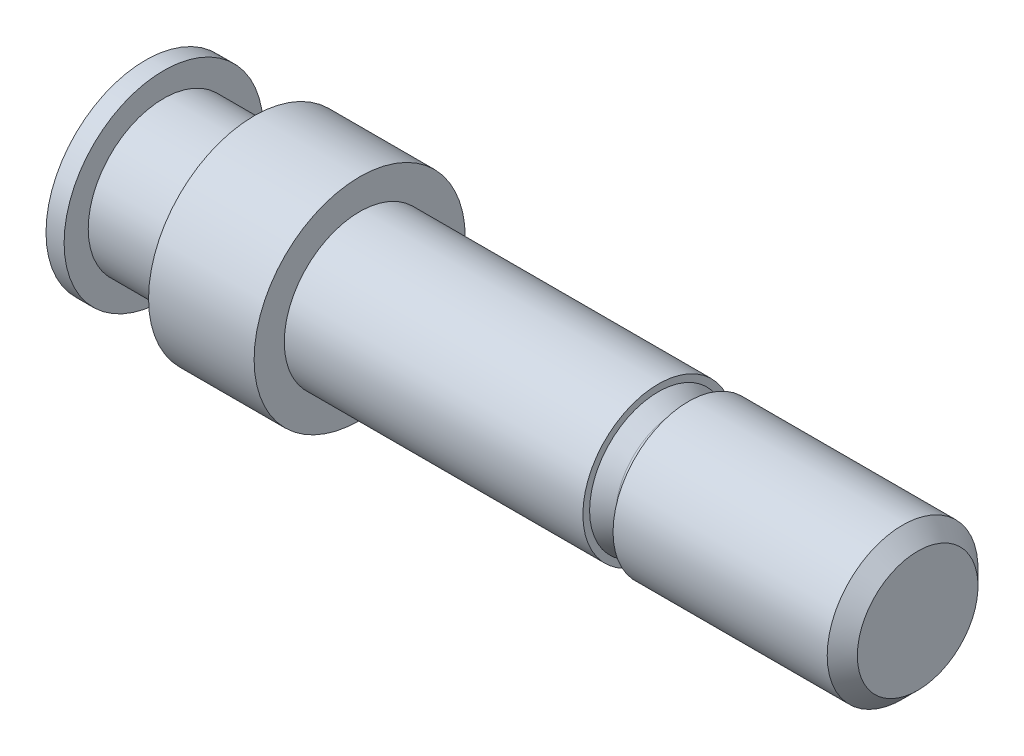
ISO-10303-21;
HEADER;
FILE_DESCRIPTION(('STEP AP214'),'2;1');
FILE_NAME('part.step','',(''),(''),'','','');
FILE_SCHEMA(('AUTOMOTIVE_DESIGN { 1 0 10303 214 1 1 1 1 }'));
ENDSEC;
DATA;
#1=APPLICATION_CONTEXT('core data for automotive mechanical design processes');
#2=APPLICATION_PROTOCOL_DEFINITION('international standard','automotive_design',2000,#1);
#3=PRODUCT_CONTEXT('',#1,'mechanical');
#4=PRODUCT('Part','Part','',(#3));
#5=PRODUCT_RELATED_PRODUCT_CATEGORY('part','',(#4));
#6=PRODUCT_DEFINITION_FORMATION('','',#4);
#7=PRODUCT_DEFINITION_CONTEXT('part definition',#1,'design');
#8=PRODUCT_DEFINITION('design','',#6,#7);
#9=PRODUCT_DEFINITION_SHAPE('','',#8);
#10=(LENGTH_UNIT() NAMED_UNIT(*) SI_UNIT(.MILLI.,.METRE.));
#11=(NAMED_UNIT(*) PLANE_ANGLE_UNIT() SI_UNIT($,.RADIAN.));
#12=(NAMED_UNIT(*) SI_UNIT($,.STERADIAN.) SOLID_ANGLE_UNIT());
#13=UNCERTAINTY_MEASURE_WITH_UNIT(LENGTH_MEASURE(1.E-05),#10,'distance_accuracy_value','');
#14=(GEOMETRIC_REPRESENTATION_CONTEXT(3) GLOBAL_UNCERTAINTY_ASSIGNED_CONTEXT((#13)) GLOBAL_UNIT_ASSIGNED_CONTEXT((#10,
#11,#12)) REPRESENTATION_CONTEXT('',''));
#15=CARTESIAN_POINT('',(0.,0.,0.));
#16=DIRECTION('',(0.,0.,1.));
#17=DIRECTION('',(1.,0.,0.));
#18=AXIS2_PLACEMENT_3D('',#15,#16,#17);
#19=CARTESIAN_POINT('',(0.,0.,0.));
#20=DIRECTION('',(-1.,0.,0.));
#21=DIRECTION('',(0.,0.,1.));
#22=AXIS2_PLACEMENT_3D('',#19,#20,#21);
#23=CYLINDRICAL_SURFACE('',#22,2.5);
#24=CARTESIAN_POINT('',(7.1,0.,0.));
#25=DIRECTION('',(-1.,0.,0.));
#26=DIRECTION('',(0.,0.,1.));
#27=AXIS2_PLACEMENT_3D('',#24,#25,#26);
#28=CIRCLE('',#27,2.5);
#29=CARTESIAN_POINT('',(7.1,0.,2.5));
#30=VERTEX_POINT('',#29);
#31=EDGE_CURVE('E42',#30,#30,#28,.T.);
#32=ORIENTED_EDGE('',*,*,#31,.F.);
#33=EDGE_LOOP('',(#32));
#34=FACE_BOUND('',#33,.T.);
#35=CARTESIAN_POINT('',(17.,0.,0.));
#36=DIRECTION('',(-1.,0.,0.));
#37=DIRECTION('',(0.,0.,1.));
#38=AXIS2_PLACEMENT_3D('',#35,#36,#37);
#39=CIRCLE('',#38,2.5);
#40=CARTESIAN_POINT('',(17.,0.,2.5));
#41=VERTEX_POINT('',#40);
#42=EDGE_CURVE('E72',#41,#41,#39,.T.);
#43=ORIENTED_EDGE('',*,*,#42,.T.);
#44=EDGE_LOOP('',(#43));
#45=FACE_BOUND('',#44,.T.);
#46=ADVANCED_FACE('F31',(#34,#45),#23,.T.);
#47=CARTESIAN_POINT('',(7.1,2.5,0.));
#48=DIRECTION('',(-1.,0.,0.));
#49=DIRECTION('',(0.,0.,1.));
#50=AXIS2_PLACEMENT_3D('',#47,#48,#49);
#51=PLANE('',#50);
#52=CARTESIAN_POINT('',(7.1,0.,0.));
#53=DIRECTION('',(-1.,0.,0.));
#54=DIRECTION('',(0.,0.,1.));
#55=AXIS2_PLACEMENT_3D('',#52,#53,#54);
#56=CIRCLE('',#55,3.5);
#57=CARTESIAN_POINT('',(7.1,0.,3.5));
#58=VERTEX_POINT('',#57);
#59=EDGE_CURVE('E46',#58,#58,#56,.T.);
#60=ORIENTED_EDGE('',*,*,#59,.F.);
#61=EDGE_LOOP('',(#60));
#62=FACE_BOUND('',#61,.T.);
#63=ORIENTED_EDGE('',*,*,#31,.T.);
#64=EDGE_LOOP('',(#63));
#65=FACE_BOUND('',#64,.T.);
#66=ADVANCED_FACE('F100',(#62,#65),#51,.F.);
#67=CARTESIAN_POINT('',(0.,0.,0.));
#68=DIRECTION('',(-1.,0.,0.));
#69=DIRECTION('',(0.,0.,1.));
#70=AXIS2_PLACEMENT_3D('',#67,#68,#69);
#71=CYLINDRICAL_SURFACE('',#70,3.5);
#72=CARTESIAN_POINT('',(3.6,0.,0.));
#73=DIRECTION('',(-1.,0.,0.));
#74=DIRECTION('',(0.,0.,1.));
#75=AXIS2_PLACEMENT_3D('',#72,#73,#74);
#76=CIRCLE('',#75,3.5);
#77=CARTESIAN_POINT('',(3.6,0.,3.5));
#78=VERTEX_POINT('',#77);
#79=EDGE_CURVE('E51',#78,#78,#76,.T.);
#80=ORIENTED_EDGE('',*,*,#79,.F.);
#81=EDGE_LOOP('',(#80));
#82=FACE_BOUND('',#81,.T.);
#83=ORIENTED_EDGE('',*,*,#59,.T.);
#84=EDGE_LOOP('',(#83));
#85=FACE_BOUND('',#84,.T.);
#86=ADVANCED_FACE('F107',(#82,#85),#71,.T.);
#87=CARTESIAN_POINT('',(3.6,3.5,0.));
#88=DIRECTION('',(1.,0.,0.));
#89=DIRECTION('',(0.,0.,-1.));
#90=AXIS2_PLACEMENT_3D('',#87,#88,#89);
#91=PLANE('',#90);
#92=CARTESIAN_POINT('',(3.6,0.,0.));
#93=DIRECTION('',(-1.,0.,0.));
#94=DIRECTION('',(0.,0.,1.));
#95=AXIS2_PLACEMENT_3D('',#92,#93,#94);
#96=CIRCLE('',#95,2.5);
#97=CARTESIAN_POINT('',(3.6,0.,2.5));
#98=VERTEX_POINT('',#97);
#99=EDGE_CURVE('E54',#98,#98,#96,.T.);
#100=ORIENTED_EDGE('',*,*,#99,.F.);
#101=EDGE_LOOP('',(#100));
#102=FACE_BOUND('',#101,.T.);
#103=ORIENTED_EDGE('',*,*,#79,.T.);
#104=EDGE_LOOP('',(#103));
#105=FACE_BOUND('',#104,.T.);
#106=ADVANCED_FACE('F137',(#102,#105),#91,.F.);
#107=CARTESIAN_POINT('',(0.,0.,0.));
#108=DIRECTION('',(-1.,0.,0.));
#109=DIRECTION('',(0.,0.,1.));
#110=AXIS2_PLACEMENT_3D('',#107,#108,#109);
#111=CYLINDRICAL_SURFACE('',#110,2.5);
#112=CARTESIAN_POINT('',(0.6,0.,0.));
#113=DIRECTION('',(-1.,0.,0.));
#114=DIRECTION('',(0.,0.,1.));
#115=AXIS2_PLACEMENT_3D('',#112,#113,#114);
#116=CIRCLE('',#115,2.5);
#117=CARTESIAN_POINT('',(0.6,0.,2.5));
#118=VERTEX_POINT('',#117);
#119=EDGE_CURVE('E57',#118,#118,#116,.T.);
#120=ORIENTED_EDGE('',*,*,#119,.F.);
#121=EDGE_LOOP('',(#120));
#122=FACE_BOUND('',#121,.T.);
#123=ORIENTED_EDGE('',*,*,#99,.T.);
#124=EDGE_LOOP('',(#123));
#125=FACE_BOUND('',#124,.T.);
#126=ADVANCED_FACE('F133',(#122,#125),#111,.T.);
#127=CARTESIAN_POINT('',(0.6,2.5,0.));
#128=DIRECTION('',(-1.,0.,0.));
#129=DIRECTION('',(0.,0.,1.));
#130=AXIS2_PLACEMENT_3D('',#127,#128,#129);
#131=PLANE('',#130);
#132=CARTESIAN_POINT('',(0.6,0.,0.));
#133=DIRECTION('',(-1.,0.,0.));
#134=DIRECTION('',(0.,0.,1.));
#135=AXIS2_PLACEMENT_3D('',#132,#133,#134);
#136=CIRCLE('',#135,3.3);
#137=CARTESIAN_POINT('',(0.6,0.,3.3));
#138=VERTEX_POINT('',#137);
#139=EDGE_CURVE('E60',#138,#138,#136,.T.);
#140=ORIENTED_EDGE('',*,*,#139,.F.);
#141=EDGE_LOOP('',(#140));
#142=FACE_BOUND('',#141,.T.);
#143=ORIENTED_EDGE('',*,*,#119,.T.);
#144=EDGE_LOOP('',(#143));
#145=FACE_BOUND('',#144,.T.);
#146=ADVANCED_FACE('F129',(#142,#145),#131,.F.);
#147=CARTESIAN_POINT('',(0.,0.,0.));
#148=DIRECTION('',(-1.,0.,0.));
#149=DIRECTION('',(0.,0.,1.));
#150=AXIS2_PLACEMENT_3D('',#147,#148,#149);
#151=CYLINDRICAL_SURFACE('',#150,3.3);
#152=CARTESIAN_POINT('',(0.,0.,0.));
#153=DIRECTION('',(-1.,0.,0.));
#154=DIRECTION('',(0.,0.,1.));
#155=AXIS2_PLACEMENT_3D('',#152,#153,#154);
#156=CIRCLE('',#155,3.3);
#157=CARTESIAN_POINT('',(0.,0.,3.3));
#158=VERTEX_POINT('',#157);
#159=EDGE_CURVE('E63',#158,#158,#156,.T.);
#160=ORIENTED_EDGE('',*,*,#159,.F.);
#161=EDGE_LOOP('',(#160));
#162=FACE_BOUND('',#161,.T.);
#163=ORIENTED_EDGE('',*,*,#139,.T.);
#164=EDGE_LOOP('',(#163));
#165=FACE_BOUND('',#164,.T.);
#166=ADVANCED_FACE('F126',(#162,#165),#151,.T.);
#167=CARTESIAN_POINT('',(27.125,0.,0.));
#168=DIRECTION('',(0.,0.,1.));
#169=DIRECTION('',(1.,0.,0.));
#170=AXIS2_PLACEMENT_3D('',#167,#168,#169);
#171=SPHERICAL_SURFACE('',#170,27.325);
#172=CARTESIAN_POINT('',(27.125,0.,0.));
#173=DIRECTION('',(-1.,0.,0.));
#174=DIRECTION('',(0.,0.,1.));
#175=AXIS2_PLACEMENT_3D('',#172,#173,#174);
#176=SPHERICAL_SURFACE('',#175,27.325);
#177=ORIENTED_EDGE('',*,*,#159,.T.);
#178=EDGE_LOOP('',(#177));
#179=FACE_BOUND('',#178,.T.);
#180=ADVANCED_FACE('F33',(#179),#176,.T.);
#181=CARTESIAN_POINT('',(17.7,0.,0.));
#182=DIRECTION('',(-1.,0.,0.));
#183=DIRECTION('',(0.,0.,1.));
#184=AXIS2_PLACEMENT_3D('',#181,#182,#183);
#185=TOROIDAL_SURFACE('',#184,2.21961524227066,0.299999999999999);
#186=CARTESIAN_POINT('',(18.,0.,0.));
#187=DIRECTION('',(-1.,0.,0.));
#188=DIRECTION('',(0.,0.,1.));
#189=AXIS2_PLACEMENT_3D('',#186,#187,#188);
#190=CIRCLE('',#189,2.21961524227066);
#191=CARTESIAN_POINT('',(18.,0.,2.21961524227066));
#192=VERTEX_POINT('',#191);
#193=EDGE_CURVE('E78',#192,#192,#190,.T.);
#194=ORIENTED_EDGE('',*,*,#193,.T.);
#195=EDGE_LOOP('',(#194));
#196=FACE_BOUND('',#195,.T.);
#197=CARTESIAN_POINT('',(17.55,0.,0.));
#198=DIRECTION('',(-1.,0.,0.));
#199=DIRECTION('',(0.,0.,1.));
#200=AXIS2_PLACEMENT_3D('',#197,#198,#199);
#201=CIRCLE('',#200,1.95980762113532);
#202=CARTESIAN_POINT('',(17.55,0.,1.95980762113532));
#203=VERTEX_POINT('',#202);
#204=EDGE_CURVE('E66',#203,#203,#201,.T.);
#205=ORIENTED_EDGE('',*,*,#204,.F.);
#206=EDGE_LOOP('',(#205));
#207=FACE_BOUND('',#206,.T.);
#208=ADVANCED_FACE('F82',(#196,#207),#185,.F.);
#209=CARTESIAN_POINT('',(17.,0.,0.));
#210=DIRECTION('',(-1.,0.,0.));
#211=DIRECTION('',(0.,0.,1.));
#212=AXIS2_PLACEMENT_3D('',#209,#210,#211);
#213=CONICAL_SURFACE('',#212,2.27735026918962,0.523598775598293);
#214=ORIENTED_EDGE('',*,*,#204,.T.);
#215=EDGE_LOOP('',(#214));
#216=FACE_BOUND('',#215,.T.);
#217=CARTESIAN_POINT('',(17.,0.,0.));
#218=DIRECTION('',(-1.,0.,0.));
#219=DIRECTION('',(0.,0.,1.));
#220=AXIS2_PLACEMENT_3D('',#217,#218,#219);
#221=CIRCLE('',#220,2.27735026918962);
#222=CARTESIAN_POINT('',(17.,0.,2.27735026918962));
#223=VERTEX_POINT('',#222);
#224=EDGE_CURVE('E69',#223,#223,#221,.T.);
#225=ORIENTED_EDGE('',*,*,#224,.F.);
#226=EDGE_LOOP('',(#225));
#227=FACE_BOUND('',#226,.T.);
#228=ADVANCED_FACE('F96',(#216,#227),#213,.T.);
#229=CARTESIAN_POINT('',(17.,2.27735026918962,0.));
#230=DIRECTION('',(1.,0.,0.));
#231=DIRECTION('',(0.,0.,-1.));
#232=AXIS2_PLACEMENT_3D('',#229,#230,#231);
#233=PLANE('',#232);
#234=ORIENTED_EDGE('',*,*,#224,.T.);
#235=EDGE_LOOP('',(#234));
#236=FACE_BOUND('',#235,.T.);
#237=ORIENTED_EDGE('',*,*,#42,.F.);
#238=EDGE_LOOP('',(#237));
#239=FACE_BOUND('',#238,.T.);
#240=ADVANCED_FACE('F88',(#236,#239),#233,.T.);
#241=CARTESIAN_POINT('',(18.,2.5,0.));
#242=DIRECTION('',(-1.,0.,0.));
#243=DIRECTION('',(0.,0.,1.));
#244=AXIS2_PLACEMENT_3D('',#241,#242,#243);
#245=PLANE('',#244);
#246=CARTESIAN_POINT('',(18.,0.,0.));
#247=DIRECTION('',(-1.,0.,0.));
#248=DIRECTION('',(0.,0.,1.));
#249=AXIS2_PLACEMENT_3D('',#246,#247,#248);
#250=CIRCLE('',#249,2.5);
#251=CARTESIAN_POINT('',(18.,0.,2.5));
#252=VERTEX_POINT('',#251);
#253=EDGE_CURVE('E75',#252,#252,#250,.T.);
#254=ORIENTED_EDGE('',*,*,#253,.T.);
#255=EDGE_LOOP('',(#254));
#256=FACE_BOUND('',#255,.T.);
#257=ORIENTED_EDGE('',*,*,#193,.F.);
#258=EDGE_LOOP('',(#257));
#259=FACE_BOUND('',#258,.T.);
#260=ADVANCED_FACE('F85',(#256,#259),#245,.T.);
#261=CARTESIAN_POINT('',(25.6,2.5,0.));
#262=DIRECTION('',(-1.,0.,0.));
#263=DIRECTION('',(0.,0.,1.));
#264=AXIS2_PLACEMENT_3D('',#261,#262,#263);
#265=PLANE('',#264);
#266=CARTESIAN_POINT('',(25.6,0.,0.));
#267=DIRECTION('',(-1.,0.,0.));
#268=DIRECTION('',(0.,0.,1.));
#269=AXIS2_PLACEMENT_3D('',#266,#267,#268);
#270=CIRCLE('',#269,1.99999999999999);
#271=CARTESIAN_POINT('',(25.6,0.,1.99999999999999));
#272=VERTEX_POINT('',#271);
#273=EDGE_CURVE('E10',#272,#272,#270,.F.);
#274=ORIENTED_EDGE('',*,*,#273,.T.);
#275=EDGE_LOOP('',(#274));
#276=FACE_BOUND('',#275,.T.);
#277=ADVANCED_FACE('F87',(#276),#265,.F.);
#278=CARTESIAN_POINT('',(25.1,0.,0.));
#279=DIRECTION('',(-1.,0.,0.));
#280=DIRECTION('',(0.,0.,1.));
#281=AXIS2_PLACEMENT_3D('',#278,#279,#280);
#282=CONICAL_SURFACE('',#281,2.5,0.785398163397445);
#283=ORIENTED_EDGE('',*,*,#273,.F.);
#284=EDGE_LOOP('',(#283));
#285=FACE_BOUND('',#284,.T.);
#286=CARTESIAN_POINT('',(25.1,0.,0.));
#287=DIRECTION('',(-1.,0.,0.));
#288=DIRECTION('',(0.,0.,1.));
#289=AXIS2_PLACEMENT_3D('',#286,#287,#288);
#290=CIRCLE('',#289,2.5);
#291=CARTESIAN_POINT('',(25.1,0.,2.5));
#292=VERTEX_POINT('',#291);
#293=EDGE_CURVE('E38',#292,#292,#290,.T.);
#294=ORIENTED_EDGE('',*,*,#293,.F.);
#295=EDGE_LOOP('',(#294));
#296=FACE_BOUND('',#295,.T.);
#297=ADVANCED_FACE('F95',(#285,#296),#282,.T.);
#298=ORIENTED_EDGE('',*,*,#293,.T.);
#299=EDGE_LOOP('',(#298));
#300=FACE_BOUND('',#299,.T.);
#301=ORIENTED_EDGE('',*,*,#253,.F.);
#302=EDGE_LOOP('',(#301));
#303=FACE_BOUND('',#302,.T.);
#304=ADVANCED_FACE('F103',(#300,#303),#23,.T.);
#305=CLOSED_SHELL('',(#46,#66,#86,#106,#126,#146,#166,#180,#208,#228,#240,#260,#277,#297,#304));
#306=MANIFOLD_SOLID_BREP('B2',#305);
#307=ADVANCED_BREP_SHAPE_REPRESENTATION('',(#18,#306),#14);
#308=SHAPE_DEFINITION_REPRESENTATION(#9,#307);
ENDSEC;
END-ISO-10303-21;
